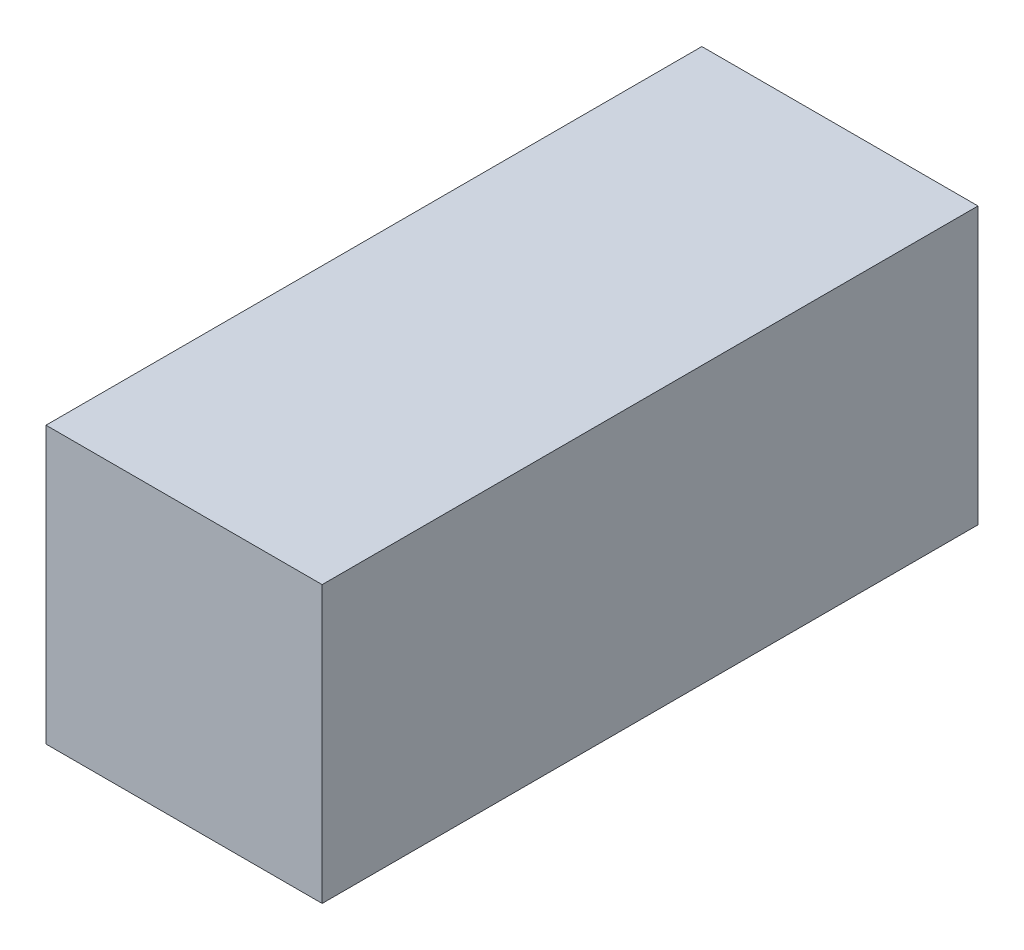
ISO-10303-21;
HEADER;
FILE_DESCRIPTION(('STEP AP214'),'2;1');
FILE_NAME('part.step','',(''),(''),'','','');
FILE_SCHEMA(('AUTOMOTIVE_DESIGN { 1 0 10303 214 1 1 1 1 }'));
ENDSEC;
DATA;
#1=APPLICATION_CONTEXT('core data for automotive mechanical design processes');
#2=APPLICATION_PROTOCOL_DEFINITION('international standard','automotive_design',2000,#1);
#3=PRODUCT_CONTEXT('',#1,'mechanical');
#4=PRODUCT('Part','Part','',(#3));
#5=PRODUCT_RELATED_PRODUCT_CATEGORY('part','',(#4));
#6=PRODUCT_DEFINITION_FORMATION('','',#4);
#7=PRODUCT_DEFINITION_CONTEXT('part definition',#1,'design');
#8=PRODUCT_DEFINITION('design','',#6,#7);
#9=PRODUCT_DEFINITION_SHAPE('','',#8);
#10=(LENGTH_UNIT() NAMED_UNIT(*) SI_UNIT(.MILLI.,.METRE.));
#11=(NAMED_UNIT(*) PLANE_ANGLE_UNIT() SI_UNIT($,.RADIAN.));
#12=(NAMED_UNIT(*) SI_UNIT($,.STERADIAN.) SOLID_ANGLE_UNIT());
#13=UNCERTAINTY_MEASURE_WITH_UNIT(LENGTH_MEASURE(1.E-05),#10,'distance_accuracy_value','');
#14=(GEOMETRIC_REPRESENTATION_CONTEXT(3) GLOBAL_UNCERTAINTY_ASSIGNED_CONTEXT((#13)) GLOBAL_UNIT_ASSIGNED_CONTEXT((#10,
#11,#12)) REPRESENTATION_CONTEXT('',''));
#15=CARTESIAN_POINT('',(0.,0.,0.));
#16=DIRECTION('',(0.,0.,1.));
#17=DIRECTION('',(1.,0.,0.));
#18=AXIS2_PLACEMENT_3D('',#15,#16,#17);
#19=CARTESIAN_POINT('',(2.,2.,9.5));
#20=DIRECTION('',(-1.,0.,0.));
#21=DIRECTION('',(0.,-1.,0.));
#22=AXIS2_PLACEMENT_3D('',#19,#20,#21);
#23=PLANE('',#22);
#24=DIRECTION('',(0.,1.,0.));
#25=VECTOR('',#24,1.);
#26=CARTESIAN_POINT('',(2.,2.,0.));
#27=LINE('',#26,#25);
#28=CARTESIAN_POINT('',(2.,-2.,0.));
#29=VERTEX_POINT('',#28);
#30=CARTESIAN_POINT('',(2.,2.,0.));
#31=VERTEX_POINT('',#30);
#32=EDGE_CURVE('E100',#29,#31,#27,.T.);
#33=ORIENTED_EDGE('',*,*,#32,.T.);
#34=DIRECTION('',(0.,0.,-1.));
#35=VECTOR('',#34,1.);
#36=CARTESIAN_POINT('',(2.,2.,9.5));
#37=LINE('',#36,#35);
#38=CARTESIAN_POINT('',(2.,2.,9.5));
#39=VERTEX_POINT('',#38);
#40=EDGE_CURVE('E11',#39,#31,#37,.T.);
#41=ORIENTED_EDGE('',*,*,#40,.F.);
#42=DIRECTION('',(0.,1.,0.));
#43=VECTOR('',#42,1.);
#44=CARTESIAN_POINT('',(2.,2.,9.5));
#45=LINE('',#44,#43);
#46=CARTESIAN_POINT('',(2.,-2.,9.5));
#47=VERTEX_POINT('',#46);
#48=EDGE_CURVE('E88',#47,#39,#45,.T.);
#49=ORIENTED_EDGE('',*,*,#48,.F.);
#50=DIRECTION('',(0.,0.,-1.));
#51=VECTOR('',#50,1.);
#52=CARTESIAN_POINT('',(2.,-2.,9.5));
#53=LINE('',#52,#51);
#54=EDGE_CURVE('E96',#47,#29,#53,.T.);
#55=ORIENTED_EDGE('',*,*,#54,.T.);
#56=EDGE_LOOP('',(#33,#41,#49,#55));
#57=FACE_BOUND('',#56,.T.);
#58=ADVANCED_FACE('F37',(#57),#23,.F.);
#59=CARTESIAN_POINT('',(-2.,2.,9.5));
#60=DIRECTION('',(0.,-1.,0.));
#61=DIRECTION('',(0.,0.,-1.));
#62=AXIS2_PLACEMENT_3D('',#59,#60,#61);
#63=PLANE('',#62);
#64=DIRECTION('',(-1.,0.,0.));
#65=VECTOR('',#64,1.);
#66=CARTESIAN_POINT('',(-2.,2.,0.));
#67=LINE('',#66,#65);
#68=CARTESIAN_POINT('',(-2.,2.,0.));
#69=VERTEX_POINT('',#68);
#70=EDGE_CURVE('E92',#31,#69,#67,.T.);
#71=ORIENTED_EDGE('',*,*,#70,.T.);
#72=DIRECTION('',(0.,0.,-1.));
#73=VECTOR('',#72,1.);
#74=CARTESIAN_POINT('',(-2.,2.,9.5));
#75=LINE('',#74,#73);
#76=CARTESIAN_POINT('',(-2.,2.,9.5));
#77=VERTEX_POINT('',#76);
#78=EDGE_CURVE('E45',#77,#69,#75,.T.);
#79=ORIENTED_EDGE('',*,*,#78,.F.);
#80=DIRECTION('',(-1.,0.,0.));
#81=VECTOR('',#80,1.);
#82=CARTESIAN_POINT('',(-2.,2.,9.5));
#83=LINE('',#82,#81);
#84=EDGE_CURVE('E83',#39,#77,#83,.T.);
#85=ORIENTED_EDGE('',*,*,#84,.F.);
#86=ORIENTED_EDGE('',*,*,#40,.T.);
#87=EDGE_LOOP('',(#71,#79,#85,#86));
#88=FACE_BOUND('',#87,.T.);
#89=ADVANCED_FACE('F91',(#88),#63,.F.);
#90=CARTESIAN_POINT('',(-2.,2.,9.5));
#91=DIRECTION('',(1.,0.,0.));
#92=DIRECTION('',(0.,1.,0.));
#93=AXIS2_PLACEMENT_3D('',#90,#91,#92);
#94=PLANE('',#93);
#95=DIRECTION('',(0.,-1.,0.));
#96=VECTOR('',#95,1.);
#97=CARTESIAN_POINT('',(-2.,2.,0.));
#98=LINE('',#97,#96);
#99=CARTESIAN_POINT('',(-2.,-2.,0.));
#100=VERTEX_POINT('',#99);
#101=EDGE_CURVE('E70',#69,#100,#98,.T.);
#102=ORIENTED_EDGE('',*,*,#101,.T.);
#103=DIRECTION('',(0.,0.,-1.));
#104=VECTOR('',#103,1.);
#105=CARTESIAN_POINT('',(-2.,-2.,9.5));
#106=LINE('',#105,#104);
#107=CARTESIAN_POINT('',(-2.,-2.,9.5));
#108=VERTEX_POINT('',#107);
#109=EDGE_CURVE('E93',#108,#100,#106,.T.);
#110=ORIENTED_EDGE('',*,*,#109,.F.);
#111=DIRECTION('',(0.,-1.,0.));
#112=VECTOR('',#111,1.);
#113=CARTESIAN_POINT('',(-2.,2.,9.5));
#114=LINE('',#113,#112);
#115=EDGE_CURVE('E86',#77,#108,#114,.T.);
#116=ORIENTED_EDGE('',*,*,#115,.F.);
#117=ORIENTED_EDGE('',*,*,#78,.T.);
#118=EDGE_LOOP('',(#102,#110,#116,#117));
#119=FACE_BOUND('',#118,.T.);
#120=ADVANCED_FACE('F94',(#119),#94,.F.);
#121=CARTESIAN_POINT('',(-2.,-2.,9.5));
#122=DIRECTION('',(0.,1.,0.));
#123=DIRECTION('',(0.,0.,1.));
#124=AXIS2_PLACEMENT_3D('',#121,#122,#123);
#125=PLANE('',#124);
#126=DIRECTION('',(1.,0.,0.));
#127=VECTOR('',#126,1.);
#128=CARTESIAN_POINT('',(-2.,-2.,0.));
#129=LINE('',#128,#127);
#130=EDGE_CURVE('E76',#100,#29,#129,.T.);
#131=ORIENTED_EDGE('',*,*,#130,.T.);
#132=ORIENTED_EDGE('',*,*,#54,.F.);
#133=DIRECTION('',(1.,0.,0.));
#134=VECTOR('',#133,1.);
#135=CARTESIAN_POINT('',(-2.,-2.,9.5));
#136=LINE('',#135,#134);
#137=EDGE_CURVE('E53',#108,#47,#136,.T.);
#138=ORIENTED_EDGE('',*,*,#137,.F.);
#139=ORIENTED_EDGE('',*,*,#109,.T.);
#140=EDGE_LOOP('',(#131,#132,#138,#139));
#141=FACE_BOUND('',#140,.T.);
#142=ADVANCED_FACE('F107',(#141),#125,.F.);
#143=CARTESIAN_POINT('',(0.,0.,9.5));
#144=DIRECTION('',(0.,0.,1.));
#145=DIRECTION('',(1.,0.,0.));
#146=AXIS2_PLACEMENT_3D('',#143,#144,#145);
#147=PLANE('',#146);
#148=ORIENTED_EDGE('',*,*,#48,.T.);
#149=ORIENTED_EDGE('',*,*,#84,.T.);
#150=ORIENTED_EDGE('',*,*,#115,.T.);
#151=ORIENTED_EDGE('',*,*,#137,.T.);
#152=EDGE_LOOP('',(#148,#149,#150,#151));
#153=FACE_BOUND('',#152,.T.);
#154=ADVANCED_FACE('F84',(#153),#147,.T.);
#155=CARTESIAN_POINT('',(0.,0.,0.));
#156=DIRECTION('',(0.,0.,1.));
#157=DIRECTION('',(1.,0.,0.));
#158=AXIS2_PLACEMENT_3D('',#155,#156,#157);
#159=PLANE('',#158);
#160=ORIENTED_EDGE('',*,*,#32,.F.);
#161=ORIENTED_EDGE('',*,*,#130,.F.);
#162=ORIENTED_EDGE('',*,*,#101,.F.);
#163=ORIENTED_EDGE('',*,*,#70,.F.);
#164=EDGE_LOOP('',(#160,#161,#162,#163));
#165=FACE_BOUND('',#164,.T.);
#166=ADVANCED_FACE('F110',(#165),#159,.F.);
#167=CLOSED_SHELL('',(#58,#89,#120,#142,#154,#166));
#168=MANIFOLD_SOLID_BREP('B2',#167);
#169=ADVANCED_BREP_SHAPE_REPRESENTATION('',(#18,#168),#14);
#170=SHAPE_DEFINITION_REPRESENTATION(#9,#169);
ENDSEC;
END-ISO-10303-21;
